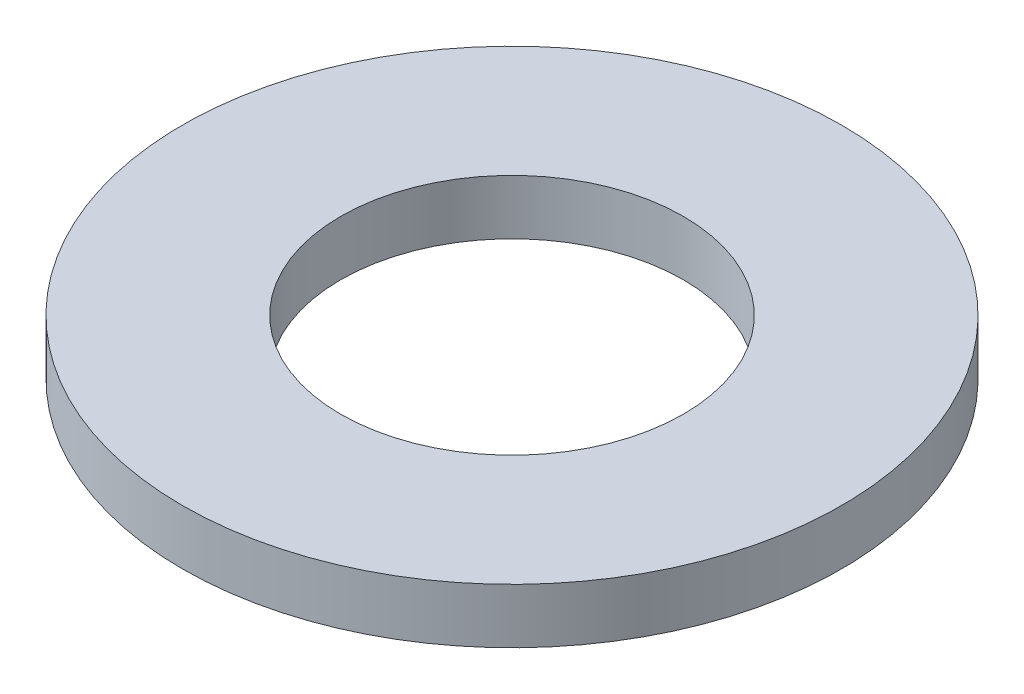
ISO-10303-21;
HEADER;
FILE_DESCRIPTION(('STEP AP214'),'2;1');
FILE_NAME('part.step','',(''),(''),'','','');
FILE_SCHEMA(('AUTOMOTIVE_DESIGN { 1 0 10303 214 1 1 1 1 }'));
ENDSEC;
DATA;
#1=APPLICATION_CONTEXT('core data for automotive mechanical design processes');
#2=APPLICATION_PROTOCOL_DEFINITION('international standard','automotive_design',2000,#1);
#3=PRODUCT_CONTEXT('',#1,'mechanical');
#4=PRODUCT('Part','Part','',(#3));
#5=PRODUCT_RELATED_PRODUCT_CATEGORY('part','',(#4));
#6=PRODUCT_DEFINITION_FORMATION('','',#4);
#7=PRODUCT_DEFINITION_CONTEXT('part definition',#1,'design');
#8=PRODUCT_DEFINITION('design','',#6,#7);
#9=PRODUCT_DEFINITION_SHAPE('','',#8);
#10=(LENGTH_UNIT() NAMED_UNIT(*) SI_UNIT(.MILLI.,.METRE.));
#11=(NAMED_UNIT(*) PLANE_ANGLE_UNIT() SI_UNIT($,.RADIAN.));
#12=(NAMED_UNIT(*) SI_UNIT($,.STERADIAN.) SOLID_ANGLE_UNIT());
#13=UNCERTAINTY_MEASURE_WITH_UNIT(LENGTH_MEASURE(1.E-05),#10,'distance_accuracy_value','');
#14=(GEOMETRIC_REPRESENTATION_CONTEXT(3) GLOBAL_UNCERTAINTY_ASSIGNED_CONTEXT((#13)) GLOBAL_UNIT_ASSIGNED_CONTEXT((#10,
#11,#12)) REPRESENTATION_CONTEXT('',''));
#15=CARTESIAN_POINT('',(0.,0.,0.));
#16=DIRECTION('',(0.,0.,1.));
#17=DIRECTION('',(1.,0.,0.));
#18=AXIS2_PLACEMENT_3D('',#15,#16,#17);
#19=CARTESIAN_POINT('',(0.,12.7,0.));
#20=DIRECTION('',(0.,1.,0.));
#21=DIRECTION('',(0.,0.,1.));
#22=AXIS2_PLACEMENT_3D('',#19,#20,#21);
#23=PLANE('',#22);
#24=CARTESIAN_POINT('',(0.,12.7,0.));
#25=DIRECTION('',(0.,1.,0.));
#26=DIRECTION('',(0.,0.,1.));
#27=AXIS2_PLACEMENT_3D('',#24,#25,#26);
#28=CIRCLE('',#27,76.2);
#29=CARTESIAN_POINT('',(0.,12.7,76.2));
#30=VERTEX_POINT('',#29);
#31=EDGE_CURVE('E10',#30,#30,#28,.T.);
#32=ORIENTED_EDGE('',*,*,#31,.T.);
#33=EDGE_LOOP('',(#32));
#34=FACE_BOUND('',#33,.T.);
#35=CARTESIAN_POINT('',(0.,12.7,0.));
#36=DIRECTION('',(0.,1.,0.));
#37=DIRECTION('',(0.,0.,1.));
#38=AXIS2_PLACEMENT_3D('',#35,#36,#37);
#39=CIRCLE('',#38,39.624);
#40=CARTESIAN_POINT('',(0.,12.7,39.624));
#41=VERTEX_POINT('',#40);
#42=EDGE_CURVE('E46',#41,#41,#39,.T.);
#43=ORIENTED_EDGE('',*,*,#42,.F.);
#44=EDGE_LOOP('',(#43));
#45=FACE_BOUND('',#44,.T.);
#46=ADVANCED_FACE('F35',(#34,#45),#23,.T.);
#47=CARTESIAN_POINT('',(0.,0.,0.));
#48=DIRECTION('',(0.,1.,0.));
#49=DIRECTION('',(0.,0.,1.));
#50=AXIS2_PLACEMENT_3D('',#47,#48,#49);
#51=PLANE('',#50);
#52=CARTESIAN_POINT('',(0.,0.,0.));
#53=DIRECTION('',(0.,1.,0.));
#54=DIRECTION('',(0.,0.,1.));
#55=AXIS2_PLACEMENT_3D('',#52,#53,#54);
#56=CIRCLE('',#55,76.2);
#57=CARTESIAN_POINT('',(0.,0.,76.2));
#58=VERTEX_POINT('',#57);
#59=EDGE_CURVE('E39',#58,#58,#56,.T.);
#60=ORIENTED_EDGE('',*,*,#59,.F.);
#61=EDGE_LOOP('',(#60));
#62=FACE_BOUND('',#61,.T.);
#63=CARTESIAN_POINT('',(0.,0.,0.));
#64=DIRECTION('',(0.,1.,0.));
#65=DIRECTION('',(0.,0.,1.));
#66=AXIS2_PLACEMENT_3D('',#63,#64,#65);
#67=CIRCLE('',#66,39.624);
#68=CARTESIAN_POINT('',(0.,0.,39.624));
#69=VERTEX_POINT('',#68);
#70=EDGE_CURVE('E48',#69,#69,#67,.T.);
#71=ORIENTED_EDGE('',*,*,#70,.T.);
#72=EDGE_LOOP('',(#71));
#73=FACE_BOUND('',#72,.T.);
#74=ADVANCED_FACE('F58',(#62,#73),#51,.F.);
#75=CARTESIAN_POINT('',(0.,12.7,0.));
#76=DIRECTION('',(0.,-1.,0.));
#77=DIRECTION('',(0.,0.,-1.));
#78=AXIS2_PLACEMENT_3D('',#75,#76,#77);
#79=CYLINDRICAL_SURFACE('',#78,76.2);
#80=ORIENTED_EDGE('',*,*,#31,.F.);
#81=EDGE_LOOP('',(#80));
#82=FACE_BOUND('',#81,.T.);
#83=ORIENTED_EDGE('',*,*,#59,.T.);
#84=EDGE_LOOP('',(#83));
#85=FACE_BOUND('',#84,.T.);
#86=ADVANCED_FACE('F37',(#82,#85),#79,.T.);
#87=CARTESIAN_POINT('',(0.,12.7,0.));
#88=DIRECTION('',(0.,-1.,0.));
#89=DIRECTION('',(0.,0.,-1.));
#90=AXIS2_PLACEMENT_3D('',#87,#88,#89);
#91=CYLINDRICAL_SURFACE('',#90,39.624);
#92=ORIENTED_EDGE('',*,*,#42,.T.);
#93=EDGE_LOOP('',(#92));
#94=FACE_BOUND('',#93,.T.);
#95=ORIENTED_EDGE('',*,*,#70,.F.);
#96=EDGE_LOOP('',(#95));
#97=FACE_BOUND('',#96,.T.);
#98=ADVANCED_FACE('F54',(#94,#97),#91,.F.);
#99=CLOSED_SHELL('',(#46,#74,#86,#98));
#100=MANIFOLD_SOLID_BREP('B2',#99);
#101=ADVANCED_BREP_SHAPE_REPRESENTATION('',(#18,#100),#14);
#102=SHAPE_DEFINITION_REPRESENTATION(#9,#101);
ENDSEC;
END-ISO-10303-21;
